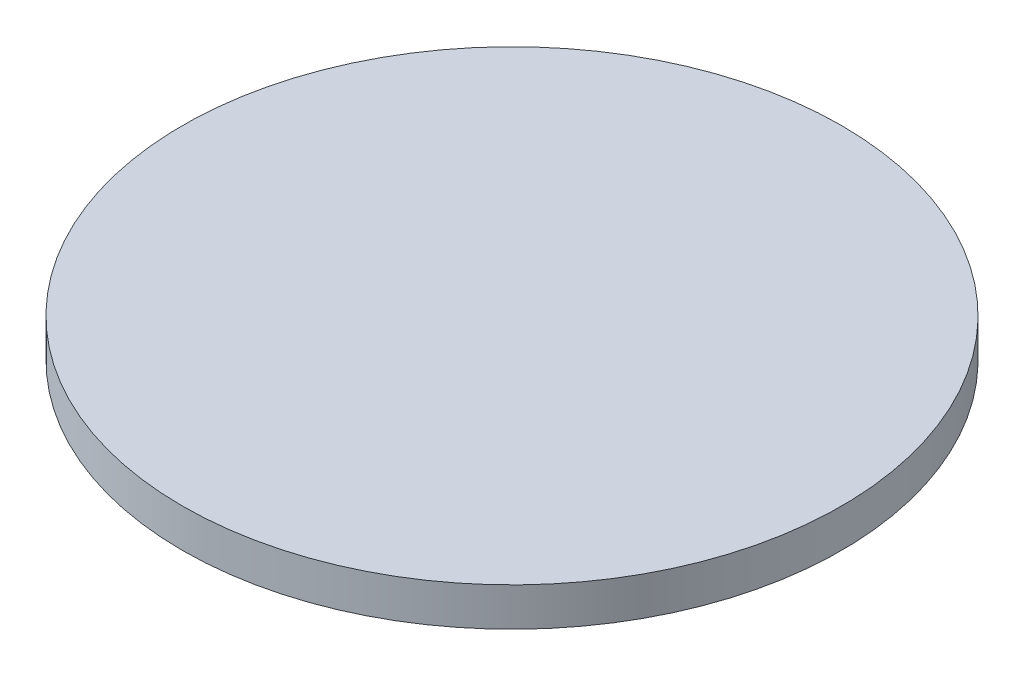
ISO-10303-21;
HEADER;
FILE_DESCRIPTION(('STEP AP214'),'2;1');
FILE_NAME('part.step','',(''),(''),'','','');
FILE_SCHEMA(('AUTOMOTIVE_DESIGN { 1 0 10303 214 1 1 1 1 }'));
ENDSEC;
DATA;
#1=APPLICATION_CONTEXT('core data for automotive mechanical design processes');
#2=APPLICATION_PROTOCOL_DEFINITION('international standard','automotive_design',2000,#1);
#3=PRODUCT_CONTEXT('',#1,'mechanical');
#4=PRODUCT('Part','Part','',(#3));
#5=PRODUCT_RELATED_PRODUCT_CATEGORY('part','',(#4));
#6=PRODUCT_DEFINITION_FORMATION('','',#4);
#7=PRODUCT_DEFINITION_CONTEXT('part definition',#1,'design');
#8=PRODUCT_DEFINITION('design','',#6,#7);
#9=PRODUCT_DEFINITION_SHAPE('','',#8);
#10=(LENGTH_UNIT() NAMED_UNIT(*) SI_UNIT(.MILLI.,.METRE.));
#11=(NAMED_UNIT(*) PLANE_ANGLE_UNIT() SI_UNIT($,.RADIAN.));
#12=(NAMED_UNIT(*) SI_UNIT($,.STERADIAN.) SOLID_ANGLE_UNIT());
#13=UNCERTAINTY_MEASURE_WITH_UNIT(LENGTH_MEASURE(1.E-05),#10,'distance_accuracy_value','');
#14=(GEOMETRIC_REPRESENTATION_CONTEXT(3) GLOBAL_UNCERTAINTY_ASSIGNED_CONTEXT((#13)) GLOBAL_UNIT_ASSIGNED_CONTEXT((#10,
#11,#12)) REPRESENTATION_CONTEXT('',''));
#15=CARTESIAN_POINT('',(0.,0.,0.));
#16=DIRECTION('',(0.,0.,1.));
#17=DIRECTION('',(1.,0.,0.));
#18=AXIS2_PLACEMENT_3D('',#15,#16,#17);
#19=CARTESIAN_POINT('',(0.,7.,0.));
#20=DIRECTION('',(0.,-1.,0.));
#21=DIRECTION('',(0.,0.,-1.));
#22=AXIS2_PLACEMENT_3D('',#19,#20,#21);
#23=CYLINDRICAL_SURFACE('',#22,60.);
#24=CARTESIAN_POINT('',(0.,7.,0.));
#25=DIRECTION('',(0.,1.,0.));
#26=DIRECTION('',(0.,0.,1.));
#27=AXIS2_PLACEMENT_3D('',#24,#25,#26);
#28=CIRCLE('',#27,60.);
#29=CARTESIAN_POINT('',(0.,7.,60.));
#30=VERTEX_POINT('',#29);
#31=EDGE_CURVE('E10',#30,#30,#28,.T.);
#32=ORIENTED_EDGE('',*,*,#31,.F.);
#33=EDGE_LOOP('',(#32));
#34=FACE_BOUND('',#33,.T.);
#35=CARTESIAN_POINT('',(0.,0.,0.));
#36=DIRECTION('',(0.,1.,0.));
#37=DIRECTION('',(0.,0.,1.));
#38=AXIS2_PLACEMENT_3D('',#35,#36,#37);
#39=CIRCLE('',#38,60.);
#40=CARTESIAN_POINT('',(0.,0.,60.));
#41=VERTEX_POINT('',#40);
#42=EDGE_CURVE('E34',#41,#41,#39,.T.);
#43=ORIENTED_EDGE('',*,*,#42,.T.);
#44=EDGE_LOOP('',(#43));
#45=FACE_BOUND('',#44,.T.);
#46=ADVANCED_FACE('F31',(#34,#45),#23,.T.);
#47=CARTESIAN_POINT('',(0.,7.,0.));
#48=DIRECTION('',(0.,1.,0.));
#49=DIRECTION('',(0.,0.,1.));
#50=AXIS2_PLACEMENT_3D('',#47,#48,#49);
#51=PLANE('',#50);
#52=ORIENTED_EDGE('',*,*,#31,.T.);
#53=EDGE_LOOP('',(#52));
#54=FACE_BOUND('',#53,.T.);
#55=ADVANCED_FACE('F46',(#54),#51,.T.);
#56=CARTESIAN_POINT('',(0.,0.,0.));
#57=DIRECTION('',(0.,1.,0.));
#58=DIRECTION('',(0.,0.,1.));
#59=AXIS2_PLACEMENT_3D('',#56,#57,#58);
#60=PLANE('',#59);
#61=ORIENTED_EDGE('',*,*,#42,.F.);
#62=EDGE_LOOP('',(#61));
#63=FACE_BOUND('',#62,.T.);
#64=ADVANCED_FACE('F44',(#63),#60,.F.);
#65=CLOSED_SHELL('',(#46,#55,#64));
#66=MANIFOLD_SOLID_BREP('B2',#65);
#67=ADVANCED_BREP_SHAPE_REPRESENTATION('',(#18,#66),#14);
#68=SHAPE_DEFINITION_REPRESENTATION(#9,#67);
ENDSEC;
END-ISO-10303-21;
